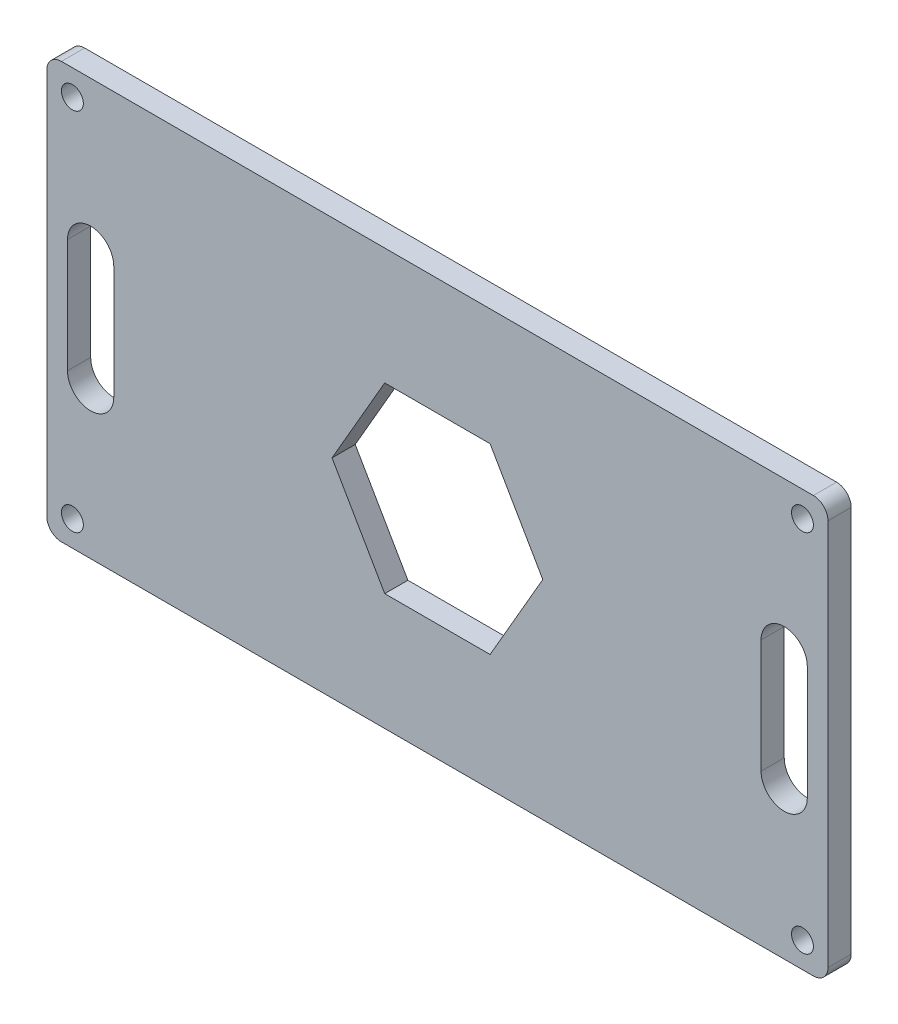
ISO-10303-21;
HEADER;
FILE_DESCRIPTION(('STEP AP214'),'2;1');
FILE_NAME('part.step','',(''),(''),'','','');
FILE_SCHEMA(('AUTOMOTIVE_DESIGN { 1 0 10303 214 1 1 1 1 }'));
ENDSEC;
DATA;
#1=APPLICATION_CONTEXT('core data for automotive mechanical design processes');
#2=APPLICATION_PROTOCOL_DEFINITION('international standard','automotive_design',2000,#1);
#3=PRODUCT_CONTEXT('',#1,'mechanical');
#4=PRODUCT('Part','Part','',(#3));
#5=PRODUCT_RELATED_PRODUCT_CATEGORY('part','',(#4));
#6=PRODUCT_DEFINITION_FORMATION('','',#4);
#7=PRODUCT_DEFINITION_CONTEXT('part definition',#1,'design');
#8=PRODUCT_DEFINITION('design','',#6,#7);
#9=PRODUCT_DEFINITION_SHAPE('','',#8);
#10=(LENGTH_UNIT() NAMED_UNIT(*) SI_UNIT(.MILLI.,.METRE.));
#11=(NAMED_UNIT(*) PLANE_ANGLE_UNIT() SI_UNIT($,.RADIAN.));
#12=(NAMED_UNIT(*) SI_UNIT($,.STERADIAN.) SOLID_ANGLE_UNIT());
#13=UNCERTAINTY_MEASURE_WITH_UNIT(LENGTH_MEASURE(1.E-05),#10,'distance_accuracy_value','');
#14=(GEOMETRIC_REPRESENTATION_CONTEXT(3) GLOBAL_UNCERTAINTY_ASSIGNED_CONTEXT((#13)) GLOBAL_UNIT_ASSIGNED_CONTEXT((#10,
#11,#12)) REPRESENTATION_CONTEXT('',''));
#15=CARTESIAN_POINT('',(0.,0.,0.));
#16=DIRECTION('',(0.,0.,1.));
#17=DIRECTION('',(1.,0.,0.));
#18=AXIS2_PLACEMENT_3D('',#15,#16,#17);
#19=CARTESIAN_POINT('',(0.,0.,3.175));
#20=DIRECTION('',(0.,0.,1.));
#21=DIRECTION('',(1.,0.,0.));
#22=AXIS2_PLACEMENT_3D('',#19,#20,#21);
#23=PLANE('',#22);
#24=DIRECTION('',(0.5,0.866025403784439,0.));
#25=VECTOR('',#24,1.);
#26=CARTESIAN_POINT('',(7.21687836487032,-12.5,3.175));
#27=LINE('',#26,#25);
#28=CARTESIAN_POINT('',(7.21687836487032,-12.5,3.175));
#29=VERTEX_POINT('',#28);
#30=CARTESIAN_POINT('',(14.4337567297406,0.,3.175));
#31=VERTEX_POINT('',#30);
#32=EDGE_CURVE('E48',#29,#31,#27,.T.);
#33=ORIENTED_EDGE('',*,*,#32,.F.);
#34=DIRECTION('',(1.,0.,0.));
#35=VECTOR('',#34,1.);
#36=CARTESIAN_POINT('',(-7.21687836487032,-12.5,3.175));
#37=LINE('',#36,#35);
#38=CARTESIAN_POINT('',(-7.21687836487032,-12.5,3.175));
#39=VERTEX_POINT('',#38);
#40=EDGE_CURVE('E201',#39,#29,#37,.T.);
#41=ORIENTED_EDGE('',*,*,#40,.F.);
#42=DIRECTION('',(0.5,-0.866025403784439,0.));
#43=VECTOR('',#42,1.);
#44=CARTESIAN_POINT('',(-14.4337567297406,0.,3.175));
#45=LINE('',#44,#43);
#46=CARTESIAN_POINT('',(-14.4337567297406,0.,3.175));
#47=VERTEX_POINT('',#46);
#48=EDGE_CURVE('E204',#47,#39,#45,.T.);
#49=ORIENTED_EDGE('',*,*,#48,.F.);
#50=DIRECTION('',(-0.5,-0.866025403784439,0.));
#51=VECTOR('',#50,1.);
#52=CARTESIAN_POINT('',(-7.21687836487033,12.5,3.175));
#53=LINE('',#52,#51);
#54=CARTESIAN_POINT('',(-7.21687836487033,12.5,3.175));
#55=VERTEX_POINT('',#54);
#56=EDGE_CURVE('E220',#55,#47,#53,.T.);
#57=ORIENTED_EDGE('',*,*,#56,.F.);
#58=DIRECTION('',(-1.,0.,0.));
#59=VECTOR('',#58,1.);
#60=CARTESIAN_POINT('',(7.21687836487032,12.5,3.175));
#61=LINE('',#60,#59);
#62=CARTESIAN_POINT('',(7.21687836487032,12.5,3.175));
#63=VERTEX_POINT('',#62);
#64=EDGE_CURVE('E217',#63,#55,#61,.T.);
#65=ORIENTED_EDGE('',*,*,#64,.F.);
#66=DIRECTION('',(-0.5,0.866025403784439,0.));
#67=VECTOR('',#66,1.);
#68=CARTESIAN_POINT('',(14.4337567297406,0.,3.175));
#69=LINE('',#68,#67);
#70=EDGE_CURVE('E215',#31,#63,#69,.T.);
#71=ORIENTED_EDGE('',*,*,#70,.F.);
#72=EDGE_LOOP('',(#33,#41,#49,#57,#65,#71));
#73=FACE_BOUND('',#72,.T.);
#74=CARTESIAN_POINT('',(-47.5,-7.78716256633032,3.175));
#75=DIRECTION('',(0.,0.,1.));
#76=DIRECTION('',(1.,0.,0.));
#77=AXIS2_PLACEMENT_3D('',#74,#75,#76);
#78=CIRCLE('',#77,3.16765934901572);
#79=CARTESIAN_POINT('',(-50.6676593490157,-7.78716256633032,3.175));
#80=VERTEX_POINT('',#79);
#81=CARTESIAN_POINT('',(-44.3323406509843,-7.78716256633032,3.175));
#82=VERTEX_POINT('',#81);
#83=EDGE_CURVE('E227',#80,#82,#78,.T.);
#84=ORIENTED_EDGE('',*,*,#83,.F.);
#85=DIRECTION('',(0.,-1.,0.));
#86=VECTOR('',#85,1.);
#87=CARTESIAN_POINT('',(-50.6676593490157,-7.78716256633032,3.175));
#88=LINE('',#87,#86);
#89=CARTESIAN_POINT('',(-50.6676593490157,7.78716256633032,3.175));
#90=VERTEX_POINT('',#89);
#91=EDGE_CURVE('E239',#90,#80,#88,.T.);
#92=ORIENTED_EDGE('',*,*,#91,.F.);
#93=CARTESIAN_POINT('',(-47.5,7.78716256633032,3.175));
#94=DIRECTION('',(0.,0.,1.));
#95=DIRECTION('',(1.,0.,0.));
#96=AXIS2_PLACEMENT_3D('',#93,#94,#95);
#97=CIRCLE('',#96,3.16765934901572);
#98=CARTESIAN_POINT('',(-44.3323406509843,7.78716256633032,3.175));
#99=VERTEX_POINT('',#98);
#100=EDGE_CURVE('E253',#99,#90,#97,.T.);
#101=ORIENTED_EDGE('',*,*,#100,.F.);
#102=DIRECTION('',(0.,1.,0.));
#103=VECTOR('',#102,1.);
#104=CARTESIAN_POINT('',(-44.3323406509843,-7.78716256633032,3.175));
#105=LINE('',#104,#103);
#106=EDGE_CURVE('E250',#82,#99,#105,.T.);
#107=ORIENTED_EDGE('',*,*,#106,.F.);
#108=EDGE_LOOP('',(#84,#92,#101,#107));
#109=FACE_BOUND('',#108,.T.);
#110=CARTESIAN_POINT('',(47.5,-7.78716256633032,3.175));
#111=DIRECTION('',(0.,0.,1.));
#112=DIRECTION('',(1.,0.,0.));
#113=AXIS2_PLACEMENT_3D('',#110,#111,#112);
#114=CIRCLE('',#113,3.16765934901572);
#115=CARTESIAN_POINT('',(44.3323406509843,-7.78716256633032,3.175));
#116=VERTEX_POINT('',#115);
#117=CARTESIAN_POINT('',(50.6676593490157,-7.78716256633032,3.175));
#118=VERTEX_POINT('',#117);
#119=EDGE_CURVE('E260',#116,#118,#114,.T.);
#120=ORIENTED_EDGE('',*,*,#119,.F.);
#121=DIRECTION('',(0.,-1.,0.));
#122=VECTOR('',#121,1.);
#123=CARTESIAN_POINT('',(44.3323406509843,-7.78716256633032,3.175));
#124=LINE('',#123,#122);
#125=CARTESIAN_POINT('',(44.3323406509843,7.78716256633032,3.175));
#126=VERTEX_POINT('',#125);
#127=EDGE_CURVE('E271',#126,#116,#124,.T.);
#128=ORIENTED_EDGE('',*,*,#127,.F.);
#129=CARTESIAN_POINT('',(47.5,7.78716256633032,3.175));
#130=DIRECTION('',(0.,0.,1.));
#131=DIRECTION('',(1.,0.,0.));
#132=AXIS2_PLACEMENT_3D('',#129,#130,#131);
#133=CIRCLE('',#132,3.16765934901572);
#134=CARTESIAN_POINT('',(50.6676593490157,7.78716256633032,3.175));
#135=VERTEX_POINT('',#134);
#136=EDGE_CURVE('E285',#135,#126,#133,.T.);
#137=ORIENTED_EDGE('',*,*,#136,.F.);
#138=DIRECTION('',(0.,1.,0.));
#139=VECTOR('',#138,1.);
#140=CARTESIAN_POINT('',(50.6676593490157,-7.78716256633032,3.175));
#141=LINE('',#140,#139);
#142=EDGE_CURVE('E282',#118,#135,#141,.T.);
#143=ORIENTED_EDGE('',*,*,#142,.F.);
#144=EDGE_LOOP('',(#120,#128,#137,#143));
#145=FACE_BOUND('',#144,.T.);
#146=CARTESIAN_POINT('',(-50.,-25.,3.175));
#147=DIRECTION('',(0.,0.,1.));
#148=DIRECTION('',(1.,0.,0.));
#149=AXIS2_PLACEMENT_3D('',#146,#147,#148);
#150=CIRCLE('',#149,1.5);
#151=CARTESIAN_POINT('',(-48.5,-25.,3.175));
#152=VERTEX_POINT('',#151);
#153=EDGE_CURVE('E305',#152,#152,#150,.T.);
#154=ORIENTED_EDGE('',*,*,#153,.F.);
#155=EDGE_LOOP('',(#154));
#156=FACE_BOUND('',#155,.T.);
#157=CARTESIAN_POINT('',(-50.,25.,3.175));
#158=DIRECTION('',(0.,0.,1.));
#159=DIRECTION('',(1.,0.,0.));
#160=AXIS2_PLACEMENT_3D('',#157,#158,#159);
#161=CIRCLE('',#160,1.5);
#162=CARTESIAN_POINT('',(-48.5,25.,3.175));
#163=VERTEX_POINT('',#162);
#164=EDGE_CURVE('E317',#163,#163,#161,.T.);
#165=ORIENTED_EDGE('',*,*,#164,.F.);
#166=EDGE_LOOP('',(#165));
#167=FACE_BOUND('',#166,.T.);
#168=DIRECTION('',(0.,-1.,0.));
#169=VECTOR('',#168,1.);
#170=CARTESIAN_POINT('',(-53.5,28.5,3.175));
#171=LINE('',#170,#169);
#172=CARTESIAN_POINT('',(-53.5,26.5,3.175));
#173=VERTEX_POINT('',#172);
#174=CARTESIAN_POINT('',(-53.5,-26.5,3.175));
#175=VERTEX_POINT('',#174);
#176=EDGE_CURVE('E323',#173,#175,#171,.T.);
#177=ORIENTED_EDGE('',*,*,#176,.T.);
#178=CARTESIAN_POINT('',(-51.5,-26.5,3.175));
#179=DIRECTION('',(0.,0.,1.));
#180=DIRECTION('',(1.,0.,0.));
#181=AXIS2_PLACEMENT_3D('',#178,#179,#180);
#182=CIRCLE('',#181,2.);
#183=CARTESIAN_POINT('',(-51.5,-28.5,3.175));
#184=VERTEX_POINT('',#183);
#185=EDGE_CURVE('E370',#175,#184,#182,.T.);
#186=ORIENTED_EDGE('',*,*,#185,.T.);
#187=DIRECTION('',(1.,0.,0.));
#188=VECTOR('',#187,1.);
#189=CARTESIAN_POINT('',(-53.5,-28.5,3.175));
#190=LINE('',#189,#188);
#191=CARTESIAN_POINT('',(51.5,-28.5,3.175));
#192=VERTEX_POINT('',#191);
#193=EDGE_CURVE('E326',#184,#192,#190,.T.);
#194=ORIENTED_EDGE('',*,*,#193,.T.);
#195=CARTESIAN_POINT('',(51.5,-26.5,3.175));
#196=DIRECTION('',(0.,0.,1.));
#197=DIRECTION('',(1.,0.,0.));
#198=AXIS2_PLACEMENT_3D('',#195,#196,#197);
#199=CIRCLE('',#198,2.);
#200=CARTESIAN_POINT('',(53.5,-26.5,3.175));
#201=VERTEX_POINT('',#200);
#202=EDGE_CURVE('E368',#192,#201,#199,.T.);
#203=ORIENTED_EDGE('',*,*,#202,.T.);
#204=DIRECTION('',(0.,1.,0.));
#205=VECTOR('',#204,1.);
#206=CARTESIAN_POINT('',(53.5,28.5,3.175));
#207=LINE('',#206,#205);
#208=CARTESIAN_POINT('',(53.5,26.5,3.175));
#209=VERTEX_POINT('',#208);
#210=EDGE_CURVE('E330',#201,#209,#207,.T.);
#211=ORIENTED_EDGE('',*,*,#210,.T.);
#212=CARTESIAN_POINT('',(51.5,26.5,3.175));
#213=DIRECTION('',(0.,0.,1.));
#214=DIRECTION('',(1.,0.,0.));
#215=AXIS2_PLACEMENT_3D('',#212,#213,#214);
#216=CIRCLE('',#215,2.);
#217=CARTESIAN_POINT('',(51.5,28.5,3.175));
#218=VERTEX_POINT('',#217);
#219=EDGE_CURVE('E366',#209,#218,#216,.T.);
#220=ORIENTED_EDGE('',*,*,#219,.T.);
#221=DIRECTION('',(-1.,0.,0.));
#222=VECTOR('',#221,1.);
#223=CARTESIAN_POINT('',(-53.5,28.5,3.175));
#224=LINE('',#223,#222);
#225=CARTESIAN_POINT('',(-51.5,28.5,3.175));
#226=VERTEX_POINT('',#225);
#227=EDGE_CURVE('E333',#218,#226,#224,.T.);
#228=ORIENTED_EDGE('',*,*,#227,.T.);
#229=CARTESIAN_POINT('',(-51.5,26.5,3.175));
#230=DIRECTION('',(0.,0.,1.));
#231=DIRECTION('',(1.,0.,0.));
#232=AXIS2_PLACEMENT_3D('',#229,#230,#231);
#233=CIRCLE('',#232,2.);
#234=EDGE_CURVE('E364',#226,#173,#233,.T.);
#235=ORIENTED_EDGE('',*,*,#234,.T.);
#236=EDGE_LOOP('',(#177,#186,#194,#203,#211,#220,#228,#235));
#237=FACE_BOUND('',#236,.T.);
#238=CARTESIAN_POINT('',(50.,25.,3.175));
#239=DIRECTION('',(0.,0.,1.));
#240=DIRECTION('',(1.,0.,0.));
#241=AXIS2_PLACEMENT_3D('',#238,#239,#240);
#242=CIRCLE('',#241,1.5);
#243=CARTESIAN_POINT('',(51.5,25.,3.175));
#244=VERTEX_POINT('',#243);
#245=EDGE_CURVE('E311',#244,#244,#242,.T.);
#246=ORIENTED_EDGE('',*,*,#245,.F.);
#247=EDGE_LOOP('',(#246));
#248=FACE_BOUND('',#247,.T.);
#249=CARTESIAN_POINT('',(50.,-25.,3.175));
#250=DIRECTION('',(0.,0.,1.));
#251=DIRECTION('',(1.,0.,0.));
#252=AXIS2_PLACEMENT_3D('',#249,#250,#251);
#253=CIRCLE('',#252,1.5);
#254=CARTESIAN_POINT('',(51.5,-25.,3.175));
#255=VERTEX_POINT('',#254);
#256=EDGE_CURVE('E299',#255,#255,#253,.T.);
#257=ORIENTED_EDGE('',*,*,#256,.F.);
#258=EDGE_LOOP('',(#257));
#259=FACE_BOUND('',#258,.T.);
#260=ADVANCED_FACE('F33',(#73,#109,#145,#156,#167,#237,#248,#259),#23,.T.);
#261=CARTESIAN_POINT('',(0.,0.,0.));
#262=DIRECTION('',(0.,0.,1.));
#263=DIRECTION('',(1.,0.,0.));
#264=AXIS2_PLACEMENT_3D('',#261,#262,#263);
#265=PLANE('',#264);
#266=DIRECTION('',(1.,0.,0.));
#267=VECTOR('',#266,1.);
#268=CARTESIAN_POINT('',(-7.21687836487032,-12.5,0.));
#269=LINE('',#268,#267);
#270=CARTESIAN_POINT('',(-7.21687836487032,-12.5,0.));
#271=VERTEX_POINT('',#270);
#272=CARTESIAN_POINT('',(7.21687836487032,-12.5,0.));
#273=VERTEX_POINT('',#272);
#274=EDGE_CURVE('E190',#271,#273,#269,.T.);
#275=ORIENTED_EDGE('',*,*,#274,.T.);
#276=DIRECTION('',(0.5,0.866025403784439,0.));
#277=VECTOR('',#276,1.);
#278=CARTESIAN_POINT('',(7.21687836487032,-12.5,0.));
#279=LINE('',#278,#277);
#280=CARTESIAN_POINT('',(14.4337567297406,0.,0.));
#281=VERTEX_POINT('',#280);
#282=EDGE_CURVE('E184',#273,#281,#279,.T.);
#283=ORIENTED_EDGE('',*,*,#282,.T.);
#284=DIRECTION('',(-0.5,0.866025403784439,0.));
#285=VECTOR('',#284,1.);
#286=CARTESIAN_POINT('',(14.4337567297406,0.,0.));
#287=LINE('',#286,#285);
#288=CARTESIAN_POINT('',(7.21687836487032,12.5,0.));
#289=VERTEX_POINT('',#288);
#290=EDGE_CURVE('E193',#281,#289,#287,.T.);
#291=ORIENTED_EDGE('',*,*,#290,.T.);
#292=DIRECTION('',(-1.,0.,0.));
#293=VECTOR('',#292,1.);
#294=CARTESIAN_POINT('',(7.21687836487032,12.5,0.));
#295=LINE('',#294,#293);
#296=CARTESIAN_POINT('',(-7.21687836487033,12.5,0.));
#297=VERTEX_POINT('',#296);
#298=EDGE_CURVE('E56',#289,#297,#295,.T.);
#299=ORIENTED_EDGE('',*,*,#298,.T.);
#300=DIRECTION('',(-0.5,-0.866025403784439,0.));
#301=VECTOR('',#300,1.);
#302=CARTESIAN_POINT('',(-7.21687836487033,12.5,0.));
#303=LINE('',#302,#301);
#304=CARTESIAN_POINT('',(-14.4337567297406,0.,0.));
#305=VERTEX_POINT('',#304);
#306=EDGE_CURVE('E208',#297,#305,#303,.T.);
#307=ORIENTED_EDGE('',*,*,#306,.T.);
#308=DIRECTION('',(0.5,-0.866025403784439,0.));
#309=VECTOR('',#308,1.);
#310=CARTESIAN_POINT('',(-14.4337567297406,0.,0.));
#311=LINE('',#310,#309);
#312=EDGE_CURVE('E211',#305,#271,#311,.T.);
#313=ORIENTED_EDGE('',*,*,#312,.T.);
#314=EDGE_LOOP('',(#275,#283,#291,#299,#307,#313));
#315=FACE_BOUND('',#314,.T.);
#316=DIRECTION('',(0.,-1.,0.));
#317=VECTOR('',#316,1.);
#318=CARTESIAN_POINT('',(-50.6676593490157,-7.78716256633032,0.));
#319=LINE('',#318,#317);
#320=CARTESIAN_POINT('',(-50.6676593490157,7.78716256633032,0.));
#321=VERTEX_POINT('',#320);
#322=CARTESIAN_POINT('',(-50.6676593490157,-7.78716256633032,0.));
#323=VERTEX_POINT('',#322);
#324=EDGE_CURVE('E245',#321,#323,#319,.T.);
#325=ORIENTED_EDGE('',*,*,#324,.T.);
#326=CARTESIAN_POINT('',(-47.5,-7.78716256633032,0.));
#327=DIRECTION('',(0.,0.,1.));
#328=DIRECTION('',(1.,0.,0.));
#329=AXIS2_PLACEMENT_3D('',#326,#327,#328);
#330=CIRCLE('',#329,3.16765934901572);
#331=CARTESIAN_POINT('',(-44.3323406509843,-7.78716256633032,0.));
#332=VERTEX_POINT('',#331);
#333=EDGE_CURVE('E235',#323,#332,#330,.T.);
#334=ORIENTED_EDGE('',*,*,#333,.T.);
#335=DIRECTION('',(0.,1.,0.));
#336=VECTOR('',#335,1.);
#337=CARTESIAN_POINT('',(-44.3323406509843,-7.78716256633032,0.));
#338=LINE('',#337,#336);
#339=CARTESIAN_POINT('',(-44.3323406509843,7.78716256633032,0.));
#340=VERTEX_POINT('',#339);
#341=EDGE_CURVE('E238',#332,#340,#338,.T.);
#342=ORIENTED_EDGE('',*,*,#341,.T.);
#343=CARTESIAN_POINT('',(-47.5,7.78716256633032,0.));
#344=DIRECTION('',(0.,0.,1.));
#345=DIRECTION('',(1.,0.,0.));
#346=AXIS2_PLACEMENT_3D('',#343,#344,#345);
#347=CIRCLE('',#346,3.16765934901572);
#348=EDGE_CURVE('E242',#340,#321,#347,.T.);
#349=ORIENTED_EDGE('',*,*,#348,.T.);
#350=EDGE_LOOP('',(#325,#334,#342,#349));
#351=FACE_BOUND('',#350,.T.);
#352=DIRECTION('',(0.,-1.,0.));
#353=VECTOR('',#352,1.);
#354=CARTESIAN_POINT('',(44.3323406509843,-7.78716256633032,0.));
#355=LINE('',#354,#353);
#356=CARTESIAN_POINT('',(44.3323406509843,7.78716256633032,0.));
#357=VERTEX_POINT('',#356);
#358=CARTESIAN_POINT('',(44.3323406509843,-7.78716256633032,0.));
#359=VERTEX_POINT('',#358);
#360=EDGE_CURVE('E277',#357,#359,#355,.T.);
#361=ORIENTED_EDGE('',*,*,#360,.T.);
#362=CARTESIAN_POINT('',(47.5,-7.78716256633032,0.));
#363=DIRECTION('',(0.,0.,1.));
#364=DIRECTION('',(1.,0.,0.));
#365=AXIS2_PLACEMENT_3D('',#362,#363,#364);
#366=CIRCLE('',#365,3.16765934901572);
#367=CARTESIAN_POINT('',(50.6676593490157,-7.78716256633032,0.));
#368=VERTEX_POINT('',#367);
#369=EDGE_CURVE('E267',#359,#368,#366,.T.);
#370=ORIENTED_EDGE('',*,*,#369,.T.);
#371=DIRECTION('',(0.,1.,0.));
#372=VECTOR('',#371,1.);
#373=CARTESIAN_POINT('',(50.6676593490157,-7.78716256633032,0.));
#374=LINE('',#373,#372);
#375=CARTESIAN_POINT('',(50.6676593490157,7.78716256633032,0.));
#376=VERTEX_POINT('',#375);
#377=EDGE_CURVE('E270',#368,#376,#374,.T.);
#378=ORIENTED_EDGE('',*,*,#377,.T.);
#379=CARTESIAN_POINT('',(47.5,7.78716256633032,0.));
#380=DIRECTION('',(0.,0.,1.));
#381=DIRECTION('',(1.,0.,0.));
#382=AXIS2_PLACEMENT_3D('',#379,#380,#381);
#383=CIRCLE('',#382,3.16765934901572);
#384=EDGE_CURVE('E274',#376,#357,#383,.T.);
#385=ORIENTED_EDGE('',*,*,#384,.T.);
#386=EDGE_LOOP('',(#361,#370,#378,#385));
#387=FACE_BOUND('',#386,.T.);
#388=CARTESIAN_POINT('',(-50.,-25.,0.));
#389=DIRECTION('',(0.,0.,1.));
#390=DIRECTION('',(1.,0.,0.));
#391=AXIS2_PLACEMENT_3D('',#388,#389,#390);
#392=CIRCLE('',#391,1.5);
#393=CARTESIAN_POINT('',(-48.5,-25.,0.));
#394=VERTEX_POINT('',#393);
#395=EDGE_CURVE('E302',#394,#394,#392,.T.);
#396=ORIENTED_EDGE('',*,*,#395,.T.);
#397=EDGE_LOOP('',(#396));
#398=FACE_BOUND('',#397,.T.);
#399=CARTESIAN_POINT('',(-50.,25.,0.));
#400=DIRECTION('',(0.,0.,1.));
#401=DIRECTION('',(1.,0.,0.));
#402=AXIS2_PLACEMENT_3D('',#399,#400,#401);
#403=CIRCLE('',#402,1.5);
#404=CARTESIAN_POINT('',(-48.5,25.,0.));
#405=VERTEX_POINT('',#404);
#406=EDGE_CURVE('E314',#405,#405,#403,.T.);
#407=ORIENTED_EDGE('',*,*,#406,.T.);
#408=EDGE_LOOP('',(#407));
#409=FACE_BOUND('',#408,.T.);
#410=DIRECTION('',(1.,0.,0.));
#411=VECTOR('',#410,1.);
#412=CARTESIAN_POINT('',(-53.5,-28.5,0.));
#413=LINE('',#412,#411);
#414=CARTESIAN_POINT('',(-51.5,-28.5,0.));
#415=VERTEX_POINT('',#414);
#416=CARTESIAN_POINT('',(51.5,-28.5,0.));
#417=VERTEX_POINT('',#416);
#418=EDGE_CURVE('E339',#415,#417,#413,.T.);
#419=ORIENTED_EDGE('',*,*,#418,.F.);
#420=CARTESIAN_POINT('',(-51.5,-26.5,0.));
#421=DIRECTION('',(0.,0.,1.));
#422=DIRECTION('',(1.,0.,0.));
#423=AXIS2_PLACEMENT_3D('',#420,#421,#422);
#424=CIRCLE('',#423,2.);
#425=CARTESIAN_POINT('',(-53.5,-26.5,0.));
#426=VERTEX_POINT('',#425);
#427=EDGE_CURVE('E357',#415,#426,#424,.F.);
#428=ORIENTED_EDGE('',*,*,#427,.T.);
#429=DIRECTION('',(0.,-1.,0.));
#430=VECTOR('',#429,1.);
#431=CARTESIAN_POINT('',(-53.5,28.5,0.));
#432=LINE('',#431,#430);
#433=CARTESIAN_POINT('',(-53.5,26.5,0.));
#434=VERTEX_POINT('',#433);
#435=EDGE_CURVE('E320',#434,#426,#432,.T.);
#436=ORIENTED_EDGE('',*,*,#435,.F.);
#437=CARTESIAN_POINT('',(-51.5,26.5,0.));
#438=DIRECTION('',(0.,0.,1.));
#439=DIRECTION('',(1.,0.,0.));
#440=AXIS2_PLACEMENT_3D('',#437,#438,#439);
#441=CIRCLE('',#440,2.);
#442=CARTESIAN_POINT('',(-51.5,28.5,0.));
#443=VERTEX_POINT('',#442);
#444=EDGE_CURVE('E351',#434,#443,#441,.F.);
#445=ORIENTED_EDGE('',*,*,#444,.T.);
#446=DIRECTION('',(-1.,0.,0.));
#447=VECTOR('',#446,1.);
#448=CARTESIAN_POINT('',(-53.5,28.5,0.));
#449=LINE('',#448,#447);
#450=CARTESIAN_POINT('',(51.5,28.5,0.));
#451=VERTEX_POINT('',#450);
#452=EDGE_CURVE('E327',#451,#443,#449,.T.);
#453=ORIENTED_EDGE('',*,*,#452,.F.);
#454=CARTESIAN_POINT('',(51.5,26.5,0.));
#455=DIRECTION('',(0.,0.,1.));
#456=DIRECTION('',(1.,0.,0.));
#457=AXIS2_PLACEMENT_3D('',#454,#455,#456);
#458=CIRCLE('',#457,2.);
#459=CARTESIAN_POINT('',(53.5,26.5,0.));
#460=VERTEX_POINT('',#459);
#461=EDGE_CURVE('E353',#451,#460,#458,.F.);
#462=ORIENTED_EDGE('',*,*,#461,.T.);
#463=DIRECTION('',(0.,1.,0.));
#464=VECTOR('',#463,1.);
#465=CARTESIAN_POINT('',(53.5,28.5,0.));
#466=LINE('',#465,#464);
#467=CARTESIAN_POINT('',(53.5,-26.5,0.));
#468=VERTEX_POINT('',#467);
#469=EDGE_CURVE('E342',#468,#460,#466,.T.);
#470=ORIENTED_EDGE('',*,*,#469,.F.);
#471=CARTESIAN_POINT('',(51.5,-26.5,0.));
#472=DIRECTION('',(0.,0.,1.));
#473=DIRECTION('',(1.,0.,0.));
#474=AXIS2_PLACEMENT_3D('',#471,#472,#473);
#475=CIRCLE('',#474,2.);
#476=EDGE_CURVE('E355',#468,#417,#475,.F.);
#477=ORIENTED_EDGE('',*,*,#476,.T.);
#478=EDGE_LOOP('',(#419,#428,#436,#445,#453,#462,#470,#477));
#479=FACE_BOUND('',#478,.T.);
#480=CARTESIAN_POINT('',(50.,25.,0.));
#481=DIRECTION('',(0.,0.,1.));
#482=DIRECTION('',(1.,0.,0.));
#483=AXIS2_PLACEMENT_3D('',#480,#481,#482);
#484=CIRCLE('',#483,1.5);
#485=CARTESIAN_POINT('',(51.5,25.,0.));
#486=VERTEX_POINT('',#485);
#487=EDGE_CURVE('E308',#486,#486,#484,.T.);
#488=ORIENTED_EDGE('',*,*,#487,.T.);
#489=EDGE_LOOP('',(#488));
#490=FACE_BOUND('',#489,.T.);
#491=CARTESIAN_POINT('',(50.,-25.,0.));
#492=DIRECTION('',(0.,0.,1.));
#493=DIRECTION('',(1.,0.,0.));
#494=AXIS2_PLACEMENT_3D('',#491,#492,#493);
#495=CIRCLE('',#494,1.5);
#496=CARTESIAN_POINT('',(51.5,-25.,0.));
#497=VERTEX_POINT('',#496);
#498=EDGE_CURVE('E292',#497,#497,#495,.T.);
#499=ORIENTED_EDGE('',*,*,#498,.T.);
#500=EDGE_LOOP('',(#499));
#501=FACE_BOUND('',#500,.T.);
#502=ADVANCED_FACE('F197',(#315,#351,#387,#398,#409,#479,#490,#501),#265,.F.);
#503=CARTESIAN_POINT('',(-53.5,28.5,3.175));
#504=DIRECTION('',(1.,0.,0.));
#505=DIRECTION('',(0.,1.,0.));
#506=AXIS2_PLACEMENT_3D('',#503,#504,#505);
#507=PLANE('',#506);
#508=ORIENTED_EDGE('',*,*,#435,.T.);
#509=DIRECTION('',(0.,0.,-1.));
#510=VECTOR('',#509,1.);
#511=CARTESIAN_POINT('',(-53.5,-26.5,3.175));
#512=LINE('',#511,#510);
#513=EDGE_CURVE('E362',#426,#175,#512,.F.);
#514=ORIENTED_EDGE('',*,*,#513,.T.);
#515=ORIENTED_EDGE('',*,*,#176,.F.);
#516=DIRECTION('',(0.,0.,-1.));
#517=VECTOR('',#516,1.);
#518=CARTESIAN_POINT('',(-53.5,26.5,3.175));
#519=LINE('',#518,#517);
#520=EDGE_CURVE('E359',#173,#434,#519,.T.);
#521=ORIENTED_EDGE('',*,*,#520,.T.);
#522=EDGE_LOOP('',(#508,#514,#515,#521));
#523=FACE_BOUND('',#522,.T.);
#524=ADVANCED_FACE('F391',(#523),#507,.F.);
#525=CARTESIAN_POINT('',(-53.5,-28.5,3.175));
#526=DIRECTION('',(0.,1.,0.));
#527=DIRECTION('',(0.,0.,1.));
#528=AXIS2_PLACEMENT_3D('',#525,#526,#527);
#529=PLANE('',#528);
#530=ORIENTED_EDGE('',*,*,#193,.F.);
#531=DIRECTION('',(0.,0.,-1.));
#532=VECTOR('',#531,1.);
#533=CARTESIAN_POINT('',(-51.5,-28.5,3.175));
#534=LINE('',#533,#532);
#535=EDGE_CURVE('E348',#184,#415,#534,.T.);
#536=ORIENTED_EDGE('',*,*,#535,.T.);
#537=ORIENTED_EDGE('',*,*,#418,.T.);
#538=DIRECTION('',(0.,0.,-1.));
#539=VECTOR('',#538,1.);
#540=CARTESIAN_POINT('',(51.5,-28.5,3.175));
#541=LINE('',#540,#539);
#542=EDGE_CURVE('E336',#417,#192,#541,.F.);
#543=ORIENTED_EDGE('',*,*,#542,.T.);
#544=EDGE_LOOP('',(#530,#536,#537,#543));
#545=FACE_BOUND('',#544,.T.);
#546=ADVANCED_FACE('F402',(#545),#529,.F.);
#547=CARTESIAN_POINT('',(53.5,28.5,3.175));
#548=DIRECTION('',(-1.,0.,0.));
#549=DIRECTION('',(0.,-1.,0.));
#550=AXIS2_PLACEMENT_3D('',#547,#548,#549);
#551=PLANE('',#550);
#552=ORIENTED_EDGE('',*,*,#210,.F.);
#553=DIRECTION('',(0.,0.,-1.));
#554=VECTOR('',#553,1.);
#555=CARTESIAN_POINT('',(53.5,-26.5,3.175));
#556=LINE('',#555,#554);
#557=EDGE_CURVE('E374',#201,#468,#556,.T.);
#558=ORIENTED_EDGE('',*,*,#557,.T.);
#559=ORIENTED_EDGE('',*,*,#469,.T.);
#560=DIRECTION('',(0.,0.,-1.));
#561=VECTOR('',#560,1.);
#562=CARTESIAN_POINT('',(53.5,26.5,3.175));
#563=LINE('',#562,#561);
#564=EDGE_CURVE('E372',#460,#209,#563,.F.);
#565=ORIENTED_EDGE('',*,*,#564,.T.);
#566=EDGE_LOOP('',(#552,#558,#559,#565));
#567=FACE_BOUND('',#566,.T.);
#568=ADVANCED_FACE('F411',(#567),#551,.F.);
#569=CARTESIAN_POINT('',(-53.5,28.5,3.175));
#570=DIRECTION('',(0.,-1.,0.));
#571=DIRECTION('',(0.,0.,-1.));
#572=AXIS2_PLACEMENT_3D('',#569,#570,#571);
#573=PLANE('',#572);
#574=ORIENTED_EDGE('',*,*,#227,.F.);
#575=DIRECTION('',(0.,0.,-1.));
#576=VECTOR('',#575,1.);
#577=CARTESIAN_POINT('',(51.5,28.5,3.175));
#578=LINE('',#577,#576);
#579=EDGE_CURVE('E11',#218,#451,#578,.T.);
#580=ORIENTED_EDGE('',*,*,#579,.T.);
#581=ORIENTED_EDGE('',*,*,#452,.T.);
#582=DIRECTION('',(0.,0.,-1.));
#583=VECTOR('',#582,1.);
#584=CARTESIAN_POINT('',(-51.5,28.5,3.175));
#585=LINE('',#584,#583);
#586=EDGE_CURVE('E41',#443,#226,#585,.F.);
#587=ORIENTED_EDGE('',*,*,#586,.T.);
#588=EDGE_LOOP('',(#574,#580,#581,#587));
#589=FACE_BOUND('',#588,.T.);
#590=ADVANCED_FACE('F379',(#589),#573,.F.);
#591=CARTESIAN_POINT('',(-50.,25.,3.175));
#592=DIRECTION('',(0.,0.,-1.));
#593=DIRECTION('',(-1.,0.,0.));
#594=AXIS2_PLACEMENT_3D('',#591,#592,#593);
#595=CYLINDRICAL_SURFACE('',#594,1.5);
#596=ORIENTED_EDGE('',*,*,#164,.T.);
#597=EDGE_LOOP('',(#596));
#598=FACE_BOUND('',#597,.T.);
#599=ORIENTED_EDGE('',*,*,#406,.F.);
#600=EDGE_LOOP('',(#599));
#601=FACE_BOUND('',#600,.T.);
#602=ADVANCED_FACE('F431',(#598,#601),#595,.F.);
#603=CARTESIAN_POINT('',(50.,25.,3.175));
#604=DIRECTION('',(0.,0.,-1.));
#605=DIRECTION('',(-1.,0.,0.));
#606=AXIS2_PLACEMENT_3D('',#603,#604,#605);
#607=CYLINDRICAL_SURFACE('',#606,1.5);
#608=ORIENTED_EDGE('',*,*,#245,.T.);
#609=EDGE_LOOP('',(#608));
#610=FACE_BOUND('',#609,.T.);
#611=ORIENTED_EDGE('',*,*,#487,.F.);
#612=EDGE_LOOP('',(#611));
#613=FACE_BOUND('',#612,.T.);
#614=ADVANCED_FACE('F453',(#610,#613),#607,.F.);
#615=CARTESIAN_POINT('',(-50.,-25.,3.175));
#616=DIRECTION('',(0.,0.,-1.));
#617=DIRECTION('',(-1.,0.,0.));
#618=AXIS2_PLACEMENT_3D('',#615,#616,#617);
#619=CYLINDRICAL_SURFACE('',#618,1.5);
#620=ORIENTED_EDGE('',*,*,#153,.T.);
#621=EDGE_LOOP('',(#620));
#622=FACE_BOUND('',#621,.T.);
#623=ORIENTED_EDGE('',*,*,#395,.F.);
#624=EDGE_LOOP('',(#623));
#625=FACE_BOUND('',#624,.T.);
#626=ADVANCED_FACE('F447',(#622,#625),#619,.F.);
#627=CARTESIAN_POINT('',(50.,-25.,3.175));
#628=DIRECTION('',(0.,0.,-1.));
#629=DIRECTION('',(-1.,0.,0.));
#630=AXIS2_PLACEMENT_3D('',#627,#628,#629);
#631=CYLINDRICAL_SURFACE('',#630,1.5);
#632=ORIENTED_EDGE('',*,*,#256,.T.);
#633=EDGE_LOOP('',(#632));
#634=FACE_BOUND('',#633,.T.);
#635=ORIENTED_EDGE('',*,*,#498,.F.);
#636=EDGE_LOOP('',(#635));
#637=FACE_BOUND('',#636,.T.);
#638=ADVANCED_FACE('F443',(#634,#637),#631,.F.);
#639=CARTESIAN_POINT('',(-51.5,-26.5,3.175));
#640=DIRECTION('',(0.,0.,-1.));
#641=DIRECTION('',(-1.,0.,0.));
#642=AXIS2_PLACEMENT_3D('',#639,#640,#641);
#643=CYLINDRICAL_SURFACE('',#642,2.);
#644=ORIENTED_EDGE('',*,*,#185,.F.);
#645=ORIENTED_EDGE('',*,*,#513,.F.);
#646=ORIENTED_EDGE('',*,*,#427,.F.);
#647=ORIENTED_EDGE('',*,*,#535,.F.);
#648=EDGE_LOOP('',(#644,#645,#646,#647));
#649=FACE_BOUND('',#648,.T.);
#650=ADVANCED_FACE('F399',(#649),#643,.T.);
#651=CARTESIAN_POINT('',(51.5,-26.5,3.175));
#652=DIRECTION('',(0.,0.,-1.));
#653=DIRECTION('',(-1.,0.,0.));
#654=AXIS2_PLACEMENT_3D('',#651,#652,#653);
#655=CYLINDRICAL_SURFACE('',#654,2.);
#656=ORIENTED_EDGE('',*,*,#202,.F.);
#657=ORIENTED_EDGE('',*,*,#542,.F.);
#658=ORIENTED_EDGE('',*,*,#476,.F.);
#659=ORIENTED_EDGE('',*,*,#557,.F.);
#660=EDGE_LOOP('',(#656,#657,#658,#659));
#661=FACE_BOUND('',#660,.T.);
#662=ADVANCED_FACE('F408',(#661),#655,.T.);
#663=CARTESIAN_POINT('',(51.5,26.5,3.175));
#664=DIRECTION('',(0.,0.,-1.));
#665=DIRECTION('',(-1.,0.,0.));
#666=AXIS2_PLACEMENT_3D('',#663,#664,#665);
#667=CYLINDRICAL_SURFACE('',#666,2.);
#668=ORIENTED_EDGE('',*,*,#219,.F.);
#669=ORIENTED_EDGE('',*,*,#564,.F.);
#670=ORIENTED_EDGE('',*,*,#461,.F.);
#671=ORIENTED_EDGE('',*,*,#579,.F.);
#672=EDGE_LOOP('',(#668,#669,#670,#671));
#673=FACE_BOUND('',#672,.T.);
#674=ADVANCED_FACE('F414',(#673),#667,.T.);
#675=CARTESIAN_POINT('',(-51.5,26.5,3.175));
#676=DIRECTION('',(0.,0.,-1.));
#677=DIRECTION('',(-1.,0.,0.));
#678=AXIS2_PLACEMENT_3D('',#675,#676,#677);
#679=CYLINDRICAL_SURFACE('',#678,2.);
#680=ORIENTED_EDGE('',*,*,#234,.F.);
#681=ORIENTED_EDGE('',*,*,#586,.F.);
#682=ORIENTED_EDGE('',*,*,#444,.F.);
#683=ORIENTED_EDGE('',*,*,#520,.F.);
#684=EDGE_LOOP('',(#680,#681,#682,#683));
#685=FACE_BOUND('',#684,.T.);
#686=ADVANCED_FACE('F35',(#685),#679,.T.);
#687=CARTESIAN_POINT('',(47.5,-7.78716256633032,0.));
#688=DIRECTION('',(0.,0.,1.));
#689=DIRECTION('',(1.,0.,0.));
#690=AXIS2_PLACEMENT_3D('',#687,#688,#689);
#691=CYLINDRICAL_SURFACE('',#690,3.16765934901572);
#692=ORIENTED_EDGE('',*,*,#119,.T.);
#693=DIRECTION('',(0.,0.,1.));
#694=VECTOR('',#693,1.);
#695=CARTESIAN_POINT('',(50.6676593490157,-7.78716256633032,0.));
#696=LINE('',#695,#694);
#697=EDGE_CURVE('E280',#368,#118,#696,.T.);
#698=ORIENTED_EDGE('',*,*,#697,.F.);
#699=ORIENTED_EDGE('',*,*,#369,.F.);
#700=DIRECTION('',(0.,0.,1.));
#701=VECTOR('',#700,1.);
#702=CARTESIAN_POINT('',(44.3323406509843,-7.78716256633032,0.));
#703=LINE('',#702,#701);
#704=EDGE_CURVE('E290',#359,#116,#703,.T.);
#705=ORIENTED_EDGE('',*,*,#704,.T.);
#706=EDGE_LOOP('',(#692,#698,#699,#705));
#707=FACE_BOUND('',#706,.T.);
#708=ADVANCED_FACE('F420',(#707),#691,.F.);
#709=CARTESIAN_POINT('',(44.3323406509843,-7.78716256633032,0.));
#710=DIRECTION('',(-1.,0.,0.));
#711=DIRECTION('',(0.,0.,1.));
#712=AXIS2_PLACEMENT_3D('',#709,#710,#711);
#713=PLANE('',#712);
#714=ORIENTED_EDGE('',*,*,#127,.T.);
#715=ORIENTED_EDGE('',*,*,#704,.F.);
#716=ORIENTED_EDGE('',*,*,#360,.F.);
#717=DIRECTION('',(0.,0.,1.));
#718=VECTOR('',#717,1.);
#719=CARTESIAN_POINT('',(44.3323406509843,7.78716256633032,0.));
#720=LINE('',#719,#718);
#721=EDGE_CURVE('E293',#357,#126,#720,.T.);
#722=ORIENTED_EDGE('',*,*,#721,.T.);
#723=EDGE_LOOP('',(#714,#715,#716,#722));
#724=FACE_BOUND('',#723,.T.);
#725=ADVANCED_FACE('F511',(#724),#713,.F.);
#726=CARTESIAN_POINT('',(47.5,7.78716256633032,0.));
#727=DIRECTION('',(0.,0.,1.));
#728=DIRECTION('',(1.,0.,0.));
#729=AXIS2_PLACEMENT_3D('',#726,#727,#728);
#730=CYLINDRICAL_SURFACE('',#729,3.16765934901572);
#731=ORIENTED_EDGE('',*,*,#136,.T.);
#732=ORIENTED_EDGE('',*,*,#721,.F.);
#733=ORIENTED_EDGE('',*,*,#384,.F.);
#734=DIRECTION('',(0.,0.,1.));
#735=VECTOR('',#734,1.);
#736=CARTESIAN_POINT('',(50.6676593490157,7.78716256633032,0.));
#737=LINE('',#736,#735);
#738=EDGE_CURVE('E295',#376,#135,#737,.T.);
#739=ORIENTED_EDGE('',*,*,#738,.T.);
#740=EDGE_LOOP('',(#731,#732,#733,#739));
#741=FACE_BOUND('',#740,.T.);
#742=ADVANCED_FACE('F521',(#741),#730,.F.);
#743=CARTESIAN_POINT('',(50.6676593490157,-7.78716256633032,0.));
#744=DIRECTION('',(1.,0.,0.));
#745=DIRECTION('',(0.,0.,-1.));
#746=AXIS2_PLACEMENT_3D('',#743,#744,#745);
#747=PLANE('',#746);
#748=ORIENTED_EDGE('',*,*,#142,.T.);
#749=ORIENTED_EDGE('',*,*,#738,.F.);
#750=ORIENTED_EDGE('',*,*,#377,.F.);
#751=ORIENTED_EDGE('',*,*,#697,.T.);
#752=EDGE_LOOP('',(#748,#749,#750,#751));
#753=FACE_BOUND('',#752,.T.);
#754=ADVANCED_FACE('F531',(#753),#747,.F.);
#755=CARTESIAN_POINT('',(-47.5,-7.78716256633032,0.));
#756=DIRECTION('',(0.,0.,1.));
#757=DIRECTION('',(1.,0.,0.));
#758=AXIS2_PLACEMENT_3D('',#755,#756,#757);
#759=CYLINDRICAL_SURFACE('',#758,3.16765934901572);
#760=ORIENTED_EDGE('',*,*,#83,.T.);
#761=DIRECTION('',(0.,0.,1.));
#762=VECTOR('',#761,1.);
#763=CARTESIAN_POINT('',(-44.3323406509843,-7.78716256633032,0.));
#764=LINE('',#763,#762);
#765=EDGE_CURVE('E248',#332,#82,#764,.T.);
#766=ORIENTED_EDGE('',*,*,#765,.F.);
#767=ORIENTED_EDGE('',*,*,#333,.F.);
#768=DIRECTION('',(0.,0.,1.));
#769=VECTOR('',#768,1.);
#770=CARTESIAN_POINT('',(-50.6676593490157,-7.78716256633032,0.));
#771=LINE('',#770,#769);
#772=EDGE_CURVE('E258',#323,#80,#771,.T.);
#773=ORIENTED_EDGE('',*,*,#772,.T.);
#774=EDGE_LOOP('',(#760,#766,#767,#773));
#775=FACE_BOUND('',#774,.T.);
#776=ADVANCED_FACE('F541',(#775),#759,.F.);
#777=CARTESIAN_POINT('',(-50.6676593490157,-7.78716256633032,0.));
#778=DIRECTION('',(-1.,0.,0.));
#779=DIRECTION('',(0.,0.,1.));
#780=AXIS2_PLACEMENT_3D('',#777,#778,#779);
#781=PLANE('',#780);
#782=ORIENTED_EDGE('',*,*,#91,.T.);
#783=ORIENTED_EDGE('',*,*,#772,.F.);
#784=ORIENTED_EDGE('',*,*,#324,.F.);
#785=DIRECTION('',(0.,0.,1.));
#786=VECTOR('',#785,1.);
#787=CARTESIAN_POINT('',(-50.6676593490157,7.78716256633032,0.));
#788=LINE('',#787,#786);
#789=EDGE_CURVE('E261',#321,#90,#788,.T.);
#790=ORIENTED_EDGE('',*,*,#789,.T.);
#791=EDGE_LOOP('',(#782,#783,#784,#790));
#792=FACE_BOUND('',#791,.T.);
#793=ADVANCED_FACE('F550',(#792),#781,.F.);
#794=CARTESIAN_POINT('',(-47.5,7.78716256633032,0.));
#795=DIRECTION('',(0.,0.,1.));
#796=DIRECTION('',(1.,0.,0.));
#797=AXIS2_PLACEMENT_3D('',#794,#795,#796);
#798=CYLINDRICAL_SURFACE('',#797,3.16765934901572);
#799=ORIENTED_EDGE('',*,*,#100,.T.);
#800=ORIENTED_EDGE('',*,*,#789,.F.);
#801=ORIENTED_EDGE('',*,*,#348,.F.);
#802=DIRECTION('',(0.,0.,1.));
#803=VECTOR('',#802,1.);
#804=CARTESIAN_POINT('',(-44.3323406509843,7.78716256633032,0.));
#805=LINE('',#804,#803);
#806=EDGE_CURVE('E263',#340,#99,#805,.T.);
#807=ORIENTED_EDGE('',*,*,#806,.T.);
#808=EDGE_LOOP('',(#799,#800,#801,#807));
#809=FACE_BOUND('',#808,.T.);
#810=ADVANCED_FACE('F560',(#809),#798,.F.);
#811=CARTESIAN_POINT('',(-44.3323406509843,-7.78716256633032,0.));
#812=DIRECTION('',(1.,0.,0.));
#813=DIRECTION('',(0.,0.,-1.));
#814=AXIS2_PLACEMENT_3D('',#811,#812,#813);
#815=PLANE('',#814);
#816=ORIENTED_EDGE('',*,*,#106,.T.);
#817=ORIENTED_EDGE('',*,*,#806,.F.);
#818=ORIENTED_EDGE('',*,*,#341,.F.);
#819=ORIENTED_EDGE('',*,*,#765,.T.);
#820=EDGE_LOOP('',(#816,#817,#818,#819));
#821=FACE_BOUND('',#820,.T.);
#822=ADVANCED_FACE('F570',(#821),#815,.F.);
#823=CARTESIAN_POINT('',(7.21687836487032,-12.5,0.));
#824=DIRECTION('',(0.866025403784439,-0.5,0.));
#825=DIRECTION('',(0.5,0.866025403784439,0.));
#826=AXIS2_PLACEMENT_3D('',#823,#824,#825);
#827=PLANE('',#826);
#828=ORIENTED_EDGE('',*,*,#32,.T.);
#829=DIRECTION('',(0.,0.,1.));
#830=VECTOR('',#829,1.);
#831=CARTESIAN_POINT('',(14.4337567297406,0.,0.));
#832=LINE('',#831,#830);
#833=EDGE_CURVE('E180',#281,#31,#832,.T.);
#834=ORIENTED_EDGE('',*,*,#833,.F.);
#835=ORIENTED_EDGE('',*,*,#282,.F.);
#836=DIRECTION('',(0.,0.,1.));
#837=VECTOR('',#836,1.);
#838=CARTESIAN_POINT('',(7.21687836487032,-12.5,0.));
#839=LINE('',#838,#837);
#840=EDGE_CURVE('E225',#273,#29,#839,.T.);
#841=ORIENTED_EDGE('',*,*,#840,.T.);
#842=EDGE_LOOP('',(#828,#834,#835,#841));
#843=FACE_BOUND('',#842,.T.);
#844=ADVANCED_FACE('F182',(#843),#827,.F.);
#845=CARTESIAN_POINT('',(-7.21687836487032,-12.5,0.));
#846=DIRECTION('',(0.,-1.,0.));
#847=DIRECTION('',(1.,0.,0.));
#848=AXIS2_PLACEMENT_3D('',#845,#846,#847);
#849=PLANE('',#848);
#850=ORIENTED_EDGE('',*,*,#40,.T.);
#851=ORIENTED_EDGE('',*,*,#840,.F.);
#852=ORIENTED_EDGE('',*,*,#274,.F.);
#853=DIRECTION('',(0.,0.,1.));
#854=VECTOR('',#853,1.);
#855=CARTESIAN_POINT('',(-7.21687836487032,-12.5,0.));
#856=LINE('',#855,#854);
#857=EDGE_CURVE('E228',#271,#39,#856,.T.);
#858=ORIENTED_EDGE('',*,*,#857,.T.);
#859=EDGE_LOOP('',(#850,#851,#852,#858));
#860=FACE_BOUND('',#859,.T.);
#861=ADVANCED_FACE('F589',(#860),#849,.F.);
#862=CARTESIAN_POINT('',(-14.4337567297406,0.,0.));
#863=DIRECTION('',(-0.866025403784439,-0.5,0.));
#864=DIRECTION('',(0.5,-0.866025403784439,0.));
#865=AXIS2_PLACEMENT_3D('',#862,#863,#864);
#866=PLANE('',#865);
#867=ORIENTED_EDGE('',*,*,#48,.T.);
#868=ORIENTED_EDGE('',*,*,#857,.F.);
#869=ORIENTED_EDGE('',*,*,#312,.F.);
#870=DIRECTION('',(0.,0.,1.));
#871=VECTOR('',#870,1.);
#872=CARTESIAN_POINT('',(-14.4337567297406,0.,0.));
#873=LINE('',#872,#871);
#874=EDGE_CURVE('E230',#305,#47,#873,.T.);
#875=ORIENTED_EDGE('',*,*,#874,.T.);
#876=EDGE_LOOP('',(#867,#868,#869,#875));
#877=FACE_BOUND('',#876,.T.);
#878=ADVANCED_FACE('F598',(#877),#866,.F.);
#879=CARTESIAN_POINT('',(-7.21687836487033,12.5,0.));
#880=DIRECTION('',(-0.866025403784439,0.5,0.));
#881=DIRECTION('',(-0.5,-0.866025403784439,0.));
#882=AXIS2_PLACEMENT_3D('',#879,#880,#881);
#883=PLANE('',#882);
#884=ORIENTED_EDGE('',*,*,#56,.T.);
#885=ORIENTED_EDGE('',*,*,#874,.F.);
#886=ORIENTED_EDGE('',*,*,#306,.F.);
#887=DIRECTION('',(0.,0.,1.));
#888=VECTOR('',#887,1.);
#889=CARTESIAN_POINT('',(-7.21687836487033,12.5,0.));
#890=LINE('',#889,#888);
#891=EDGE_CURVE('E232',#297,#55,#890,.T.);
#892=ORIENTED_EDGE('',*,*,#891,.T.);
#893=EDGE_LOOP('',(#884,#885,#886,#892));
#894=FACE_BOUND('',#893,.T.);
#895=ADVANCED_FACE('F608',(#894),#883,.F.);
#896=CARTESIAN_POINT('',(7.21687836487032,12.5,0.));
#897=DIRECTION('',(0.,1.,0.));
#898=DIRECTION('',(0.,0.,1.));
#899=AXIS2_PLACEMENT_3D('',#896,#897,#898);
#900=PLANE('',#899);
#901=ORIENTED_EDGE('',*,*,#64,.T.);
#902=ORIENTED_EDGE('',*,*,#891,.F.);
#903=ORIENTED_EDGE('',*,*,#298,.F.);
#904=DIRECTION('',(0.,0.,1.));
#905=VECTOR('',#904,1.);
#906=CARTESIAN_POINT('',(7.21687836487032,12.5,0.));
#907=LINE('',#906,#905);
#908=EDGE_CURVE('E189',#289,#63,#907,.T.);
#909=ORIENTED_EDGE('',*,*,#908,.T.);
#910=EDGE_LOOP('',(#901,#902,#903,#909));
#911=FACE_BOUND('',#910,.T.);
#912=ADVANCED_FACE('F618',(#911),#900,.F.);
#913=CARTESIAN_POINT('',(14.4337567297406,0.,0.));
#914=DIRECTION('',(0.866025403784439,0.5,0.));
#915=DIRECTION('',(-0.5,0.866025403784439,0.));
#916=AXIS2_PLACEMENT_3D('',#913,#914,#915);
#917=PLANE('',#916);
#918=ORIENTED_EDGE('',*,*,#70,.T.);
#919=ORIENTED_EDGE('',*,*,#908,.F.);
#920=ORIENTED_EDGE('',*,*,#290,.F.);
#921=ORIENTED_EDGE('',*,*,#833,.T.);
#922=EDGE_LOOP('',(#918,#919,#920,#921));
#923=FACE_BOUND('',#922,.T.);
#924=ADVANCED_FACE('F194',(#923),#917,.F.);
#925=CLOSED_SHELL('',(#260,#502,#524,#546,#568,#590,#602,#614,#626,#638,#650,#662,#674,#686,
#708,#725,#742,#754,#776,#793,#810,#822,#844,#861,#878,#895,#912,#924));
#926=MANIFOLD_SOLID_BREP('B2',#925);
#927=ADVANCED_BREP_SHAPE_REPRESENTATION('',(#18,#926),#14);
#928=SHAPE_DEFINITION_REPRESENTATION(#9,#927);
ENDSEC;
END-ISO-10303-21;
